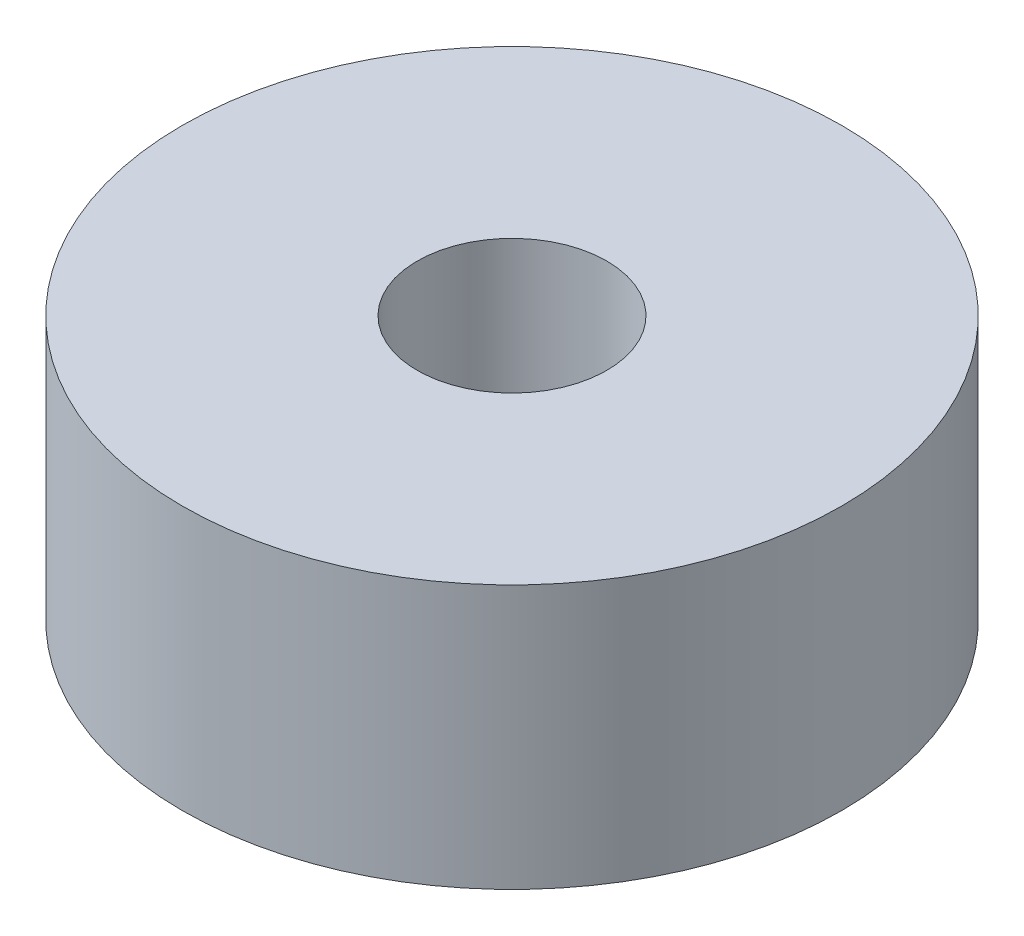
ISO-10303-21;
HEADER;
FILE_DESCRIPTION(('STEP AP214'),'2;1');
FILE_NAME('part.step','',(''),(''),'','','');
FILE_SCHEMA(('AUTOMOTIVE_DESIGN { 1 0 10303 214 1 1 1 1 }'));
ENDSEC;
DATA;
#1=APPLICATION_CONTEXT('core data for automotive mechanical design processes');
#2=APPLICATION_PROTOCOL_DEFINITION('international standard','automotive_design',2000,#1);
#3=PRODUCT_CONTEXT('',#1,'mechanical');
#4=PRODUCT('Part','Part','',(#3));
#5=PRODUCT_RELATED_PRODUCT_CATEGORY('part','',(#4));
#6=PRODUCT_DEFINITION_FORMATION('','',#4);
#7=PRODUCT_DEFINITION_CONTEXT('part definition',#1,'design');
#8=PRODUCT_DEFINITION('design','',#6,#7);
#9=PRODUCT_DEFINITION_SHAPE('','',#8);
#10=(LENGTH_UNIT() NAMED_UNIT(*) SI_UNIT(.MILLI.,.METRE.));
#11=(NAMED_UNIT(*) PLANE_ANGLE_UNIT() SI_UNIT($,.RADIAN.));
#12=(NAMED_UNIT(*) SI_UNIT($,.STERADIAN.) SOLID_ANGLE_UNIT());
#13=UNCERTAINTY_MEASURE_WITH_UNIT(LENGTH_MEASURE(1.E-05),#10,'distance_accuracy_value','');
#14=(GEOMETRIC_REPRESENTATION_CONTEXT(3) GLOBAL_UNCERTAINTY_ASSIGNED_CONTEXT((#13)) GLOBAL_UNIT_ASSIGNED_CONTEXT((#10,
#11,#12)) REPRESENTATION_CONTEXT('',''));
#15=CARTESIAN_POINT('',(0.,0.,0.));
#16=DIRECTION('',(0.,0.,1.));
#17=DIRECTION('',(1.,0.,0.));
#18=AXIS2_PLACEMENT_3D('',#15,#16,#17);
#19=CARTESIAN_POINT('',(0.,0.,0.));
#20=DIRECTION('',(0.,1.,0.));
#21=DIRECTION('',(0.,0.,1.));
#22=AXIS2_PLACEMENT_3D('',#19,#20,#21);
#23=PLANE('',#22);
#24=CARTESIAN_POINT('',(0.,0.,0.));
#25=DIRECTION('',(0.,-1.,0.));
#26=DIRECTION('',(0.,0.,-1.));
#27=AXIS2_PLACEMENT_3D('',#24,#25,#26);
#28=CIRCLE('',#27,1.15);
#29=CARTESIAN_POINT('',(0.,0.,-1.15));
#30=VERTEX_POINT('',#29);
#31=EDGE_CURVE('E28',#30,#30,#28,.F.);
#32=ORIENTED_EDGE('',*,*,#31,.T.);
#33=EDGE_LOOP('',(#32));
#34=FACE_BOUND('',#33,.T.);
#35=CARTESIAN_POINT('',(0.,0.,0.));
#36=DIRECTION('',(0.,-1.,0.));
#37=DIRECTION('',(0.,0.,-1.));
#38=AXIS2_PLACEMENT_3D('',#35,#36,#37);
#39=CIRCLE('',#38,4.);
#40=CARTESIAN_POINT('',(0.,0.,-4.));
#41=VERTEX_POINT('',#40);
#42=EDGE_CURVE('E19',#41,#41,#39,.F.);
#43=ORIENTED_EDGE('',*,*,#42,.F.);
#44=EDGE_LOOP('',(#43));
#45=FACE_BOUND('',#44,.T.);
#46=ADVANCED_FACE('F15',(#34,#45),#23,.F.);
#47=CARTESIAN_POINT('',(0.,3.2,0.));
#48=DIRECTION('',(0.,-1.,0.));
#49=DIRECTION('',(0.,0.,-1.));
#50=AXIS2_PLACEMENT_3D('',#47,#48,#49);
#51=CYLINDRICAL_SURFACE('',#50,4.);
#52=ORIENTED_EDGE('',*,*,#42,.T.);
#53=EDGE_LOOP('',(#52));
#54=FACE_BOUND('',#53,.T.);
#55=CARTESIAN_POINT('',(0.,3.2,0.));
#56=DIRECTION('',(0.,-1.,0.));
#57=DIRECTION('',(0.,0.,-1.));
#58=AXIS2_PLACEMENT_3D('',#55,#56,#57);
#59=CIRCLE('',#58,4.);
#60=CARTESIAN_POINT('',(0.,3.2,-4.));
#61=VERTEX_POINT('',#60);
#62=EDGE_CURVE('E23',#61,#61,#59,.F.);
#63=ORIENTED_EDGE('',*,*,#62,.F.);
#64=EDGE_LOOP('',(#63));
#65=FACE_BOUND('',#64,.T.);
#66=ADVANCED_FACE('F36',(#54,#65),#51,.T.);
#67=CARTESIAN_POINT('',(0.,3.2,0.));
#68=DIRECTION('',(0.,-1.,0.));
#69=DIRECTION('',(0.,0.,-1.));
#70=AXIS2_PLACEMENT_3D('',#67,#68,#69);
#71=CYLINDRICAL_SURFACE('',#70,1.15);
#72=CARTESIAN_POINT('',(0.,3.2,0.));
#73=DIRECTION('',(0.,-1.,0.));
#74=DIRECTION('',(0.,0.,-1.));
#75=AXIS2_PLACEMENT_3D('',#72,#73,#74);
#76=CIRCLE('',#75,1.15);
#77=CARTESIAN_POINT('',(0.,3.2,-1.15));
#78=VERTEX_POINT('',#77);
#79=EDGE_CURVE('E10',#78,#78,#76,.T.);
#80=ORIENTED_EDGE('',*,*,#79,.F.);
#81=EDGE_LOOP('',(#80));
#82=FACE_BOUND('',#81,.T.);
#83=ORIENTED_EDGE('',*,*,#31,.F.);
#84=EDGE_LOOP('',(#83));
#85=FACE_BOUND('',#84,.T.);
#86=ADVANCED_FACE('F45',(#82,#85),#71,.F.);
#87=CARTESIAN_POINT('',(0.,3.2,0.));
#88=DIRECTION('',(0.,1.,0.));
#89=DIRECTION('',(0.,0.,1.));
#90=AXIS2_PLACEMENT_3D('',#87,#88,#89);
#91=PLANE('',#90);
#92=ORIENTED_EDGE('',*,*,#79,.T.);
#93=EDGE_LOOP('',(#92));
#94=FACE_BOUND('',#93,.T.);
#95=ORIENTED_EDGE('',*,*,#62,.T.);
#96=EDGE_LOOP('',(#95));
#97=FACE_BOUND('',#96,.T.);
#98=ADVANCED_FACE('F17',(#94,#97),#91,.T.);
#99=CLOSED_SHELL('',(#46,#66,#86,#98));
#100=MANIFOLD_SOLID_BREP('B1',#99);
#101=ADVANCED_BREP_SHAPE_REPRESENTATION('',(#18,#100),#14);
#102=SHAPE_DEFINITION_REPRESENTATION(#9,#101);
ENDSEC;
END-ISO-10303-21;
